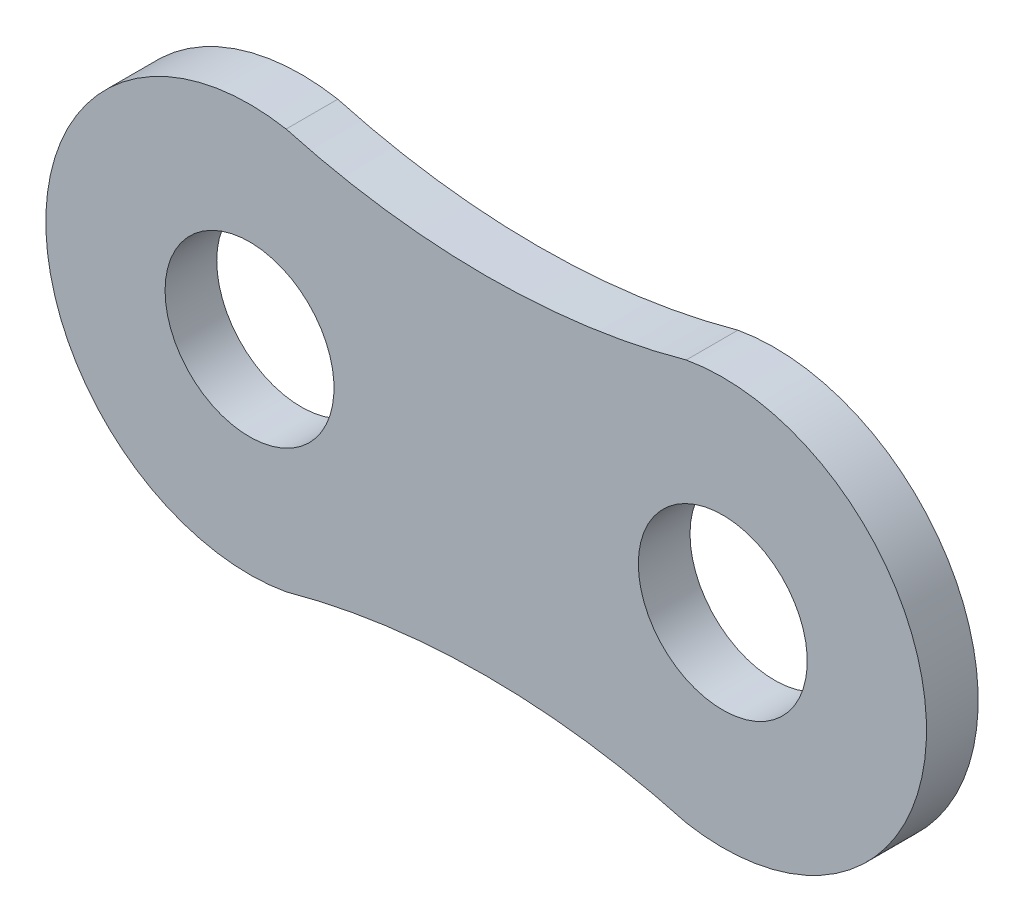
ISO-10303-21;
HEADER;
FILE_DESCRIPTION(('STEP AP214'),'2;1');
FILE_NAME('part.step','',(''),(''),'','','');
FILE_SCHEMA(('AUTOMOTIVE_DESIGN { 1 0 10303 214 1 1 1 1 }'));
ENDSEC;
DATA;
#1=APPLICATION_CONTEXT('core data for automotive mechanical design processes');
#2=APPLICATION_PROTOCOL_DEFINITION('international standard','automotive_design',2000,#1);
#3=PRODUCT_CONTEXT('',#1,'mechanical');
#4=PRODUCT('Part','Part','',(#3));
#5=PRODUCT_RELATED_PRODUCT_CATEGORY('part','',(#4));
#6=PRODUCT_DEFINITION_FORMATION('','',#4);
#7=PRODUCT_DEFINITION_CONTEXT('part definition',#1,'design');
#8=PRODUCT_DEFINITION('design','',#6,#7);
#9=PRODUCT_DEFINITION_SHAPE('','',#8);
#10=(LENGTH_UNIT() NAMED_UNIT(*) SI_UNIT(.MILLI.,.METRE.));
#11=(NAMED_UNIT(*) PLANE_ANGLE_UNIT() SI_UNIT($,.RADIAN.));
#12=(NAMED_UNIT(*) SI_UNIT($,.STERADIAN.) SOLID_ANGLE_UNIT());
#13=UNCERTAINTY_MEASURE_WITH_UNIT(LENGTH_MEASURE(1.E-05),#10,'distance_accuracy_value','');
#14=(GEOMETRIC_REPRESENTATION_CONTEXT(3) GLOBAL_UNCERTAINTY_ASSIGNED_CONTEXT((#13)) GLOBAL_UNIT_ASSIGNED_CONTEXT((#10,
#11,#12)) REPRESENTATION_CONTEXT('',''));
#15=CARTESIAN_POINT('',(0.,0.,0.));
#16=DIRECTION('',(0.,0.,1.));
#17=DIRECTION('',(1.,0.,0.));
#18=AXIS2_PLACEMENT_3D('',#15,#16,#17);
#19=CARTESIAN_POINT('',(36.135896866744,-10.7554672915547,13.84));
#20=DIRECTION('',(0.,0.,-1.));
#21=DIRECTION('',(-1.,0.,0.));
#22=AXIS2_PLACEMENT_3D('',#19,#20,#21);
#23=PLANE('',#22);
#24=CARTESIAN_POINT('',(12.7,0.,13.84));
#25=DIRECTION('',(0.,0.,-1.));
#26=DIRECTION('',(-1.,0.,0.));
#27=AXIS2_PLACEMENT_3D('',#24,#25,#26);
#28=CIRCLE('',#27,4.53333333333333);
#29=CARTESIAN_POINT('',(8.16666666666667,0.,13.84));
#30=VERTEX_POINT('',#29);
#31=EDGE_CURVE('E110',#30,#30,#28,.T.);
#32=ORIENTED_EDGE('',*,*,#31,.T.);
#33=EDGE_LOOP('',(#32));
#34=FACE_BOUND('',#33,.T.);
#35=CARTESIAN_POINT('',(38.1,0.,13.84));
#36=DIRECTION('',(0.,0.,-1.));
#37=DIRECTION('',(-1.,0.,0.));
#38=AXIS2_PLACEMENT_3D('',#35,#36,#37);
#39=CIRCLE('',#38,4.53333333333333);
#40=CARTESIAN_POINT('',(33.5666666666667,0.,13.84));
#41=VERTEX_POINT('',#40);
#42=EDGE_CURVE('E113',#41,#41,#39,.T.);
#43=ORIENTED_EDGE('',*,*,#42,.T.);
#44=EDGE_LOOP('',(#43));
#45=FACE_BOUND('',#44,.T.);
#46=CARTESIAN_POINT('',(25.4,49.4607072271947,13.84));
#47=DIRECTION('',(0.,0.,-1.));
#48=DIRECTION('',(-1.,0.,0.));
#49=AXIS2_PLACEMENT_3D('',#46,#47,#48);
#50=CIRCLE('',#49,40.1665915906267);
#51=CARTESIAN_POINT('',(36.1358968666864,10.7554672915446,13.84));
#52=VERTEX_POINT('',#51);
#53=CARTESIAN_POINT('',(14.6641031333129,10.755467291547,13.84));
#54=VERTEX_POINT('',#53);
#55=EDGE_CURVE('E87',#52,#54,#50,.T.);
#56=ORIENTED_EDGE('',*,*,#55,.T.);
#57=CARTESIAN_POINT('',(12.7,0.,13.84));
#58=DIRECTION('',(0.,0.,-1.));
#59=DIRECTION('',(-1.,0.,0.));
#60=AXIS2_PLACEMENT_3D('',#57,#58,#59);
#61=CIRCLE('',#60,10.9333333333333);
#62=CARTESIAN_POINT('',(14.6641031331999,-10.7554672915653,13.84));
#63=VERTEX_POINT('',#62);
#64=EDGE_CURVE('E86',#63,#54,#61,.T.);
#65=ORIENTED_EDGE('',*,*,#64,.F.);
#66=CARTESIAN_POINT('',(25.4,-49.4607072271733,13.84));
#67=DIRECTION('',(0.,0.,-1.));
#68=DIRECTION('',(-1.,0.,0.));
#69=AXIS2_PLACEMENT_3D('',#66,#67,#68);
#70=CIRCLE('',#69,40.1665915906267);
#71=CARTESIAN_POINT('',(36.1358968668109,-10.7554672915673,13.84));
#72=VERTEX_POINT('',#71);
#73=EDGE_CURVE('E40',#63,#72,#70,.T.);
#74=ORIENTED_EDGE('',*,*,#73,.T.);
#75=CARTESIAN_POINT('',(38.1,0.,13.84));
#76=DIRECTION('',(0.,0.,-1.));
#77=DIRECTION('',(-1.,0.,0.));
#78=AXIS2_PLACEMENT_3D('',#75,#76,#77);
#79=CIRCLE('',#78,10.9333333333333);
#80=EDGE_CURVE('E116',#52,#72,#79,.T.);
#81=ORIENTED_EDGE('',*,*,#80,.F.);
#82=EDGE_LOOP('',(#56,#65,#74,#81));
#83=FACE_BOUND('',#82,.T.);
#84=ADVANCED_FACE('F37',(#34,#45,#83),#23,.F.);
#85=CARTESIAN_POINT('',(25.4,-49.4607072271733,11.0666666666667));
#86=DIRECTION('',(0.,0.,-1.));
#87=DIRECTION('',(-1.,0.,0.));
#88=AXIS2_PLACEMENT_3D('',#85,#86,#87);
#89=CYLINDRICAL_SURFACE('',#88,40.1665915906267);
#90=ORIENTED_EDGE('',*,*,#73,.F.);
#91=DIRECTION('',(0.,0.,-1.));
#92=VECTOR('',#91,1.);
#93=CARTESIAN_POINT('',(14.664103133288,-10.7554672915493,11.0666666666667));
#94=LINE('',#93,#92);
#95=CARTESIAN_POINT('',(14.6641031331997,-10.7554672915654,11.0666666666667));
#96=VERTEX_POINT('',#95);
#97=EDGE_CURVE('E78',#96,#63,#94,.F.);
#98=ORIENTED_EDGE('',*,*,#97,.F.);
#99=CARTESIAN_POINT('',(25.4,-49.4607072271733,11.0666666666667));
#100=DIRECTION('',(0.,0.,-1.));
#101=DIRECTION('',(-1.,0.,0.));
#102=AXIS2_PLACEMENT_3D('',#99,#100,#101);
#103=CIRCLE('',#102,40.1665915906267);
#104=CARTESIAN_POINT('',(36.1358968668109,-10.7554672915673,11.0666666666667));
#105=VERTEX_POINT('',#104);
#106=EDGE_CURVE('E108',#105,#96,#103,.F.);
#107=ORIENTED_EDGE('',*,*,#106,.F.);
#108=DIRECTION('',(0.,0.,-1.));
#109=VECTOR('',#108,1.);
#110=CARTESIAN_POINT('',(36.1358968667336,-10.7554672915532,11.0666666666667));
#111=LINE('',#110,#109);
#112=EDGE_CURVE('E81',#72,#105,#111,.T.);
#113=ORIENTED_EDGE('',*,*,#112,.F.);
#114=EDGE_LOOP('',(#90,#98,#107,#113));
#115=FACE_BOUND('',#114,.T.);
#116=ADVANCED_FACE('F76',(#115),#89,.F.);
#117=CARTESIAN_POINT('',(12.7,0.,11.0666666666667));
#118=DIRECTION('',(0.,0.,-1.));
#119=DIRECTION('',(-1.,0.,0.));
#120=AXIS2_PLACEMENT_3D('',#117,#118,#119);
#121=CYLINDRICAL_SURFACE('',#120,10.9333333333333);
#122=ORIENTED_EDGE('',*,*,#64,.T.);
#123=DIRECTION('',(0.,0.,-1.));
#124=VECTOR('',#123,1.);
#125=CARTESIAN_POINT('',(14.6641031332892,10.7554672915535,11.0666666666667));
#126=LINE('',#125,#124);
#127=CARTESIAN_POINT('',(14.6641031333129,10.755467291547,11.0666666666667));
#128=VERTEX_POINT('',#127);
#129=EDGE_CURVE('E96',#54,#128,#126,.T.);
#130=ORIENTED_EDGE('',*,*,#129,.T.);
#131=CARTESIAN_POINT('',(12.7,0.,11.0666666666667));
#132=DIRECTION('',(0.,0.,-1.));
#133=DIRECTION('',(-1.,0.,0.));
#134=AXIS2_PLACEMENT_3D('',#131,#132,#133);
#135=CIRCLE('',#134,10.9333333333333);
#136=EDGE_CURVE('E92',#96,#128,#135,.T.);
#137=ORIENTED_EDGE('',*,*,#136,.F.);
#138=ORIENTED_EDGE('',*,*,#97,.T.);
#139=EDGE_LOOP('',(#122,#130,#137,#138));
#140=FACE_BOUND('',#139,.T.);
#141=ADVANCED_FACE('F90',(#140),#121,.T.);
#142=CARTESIAN_POINT('',(25.4,49.4607072271947,11.0666666666667));
#143=DIRECTION('',(0.,0.,-1.));
#144=DIRECTION('',(-1.,0.,0.));
#145=AXIS2_PLACEMENT_3D('',#142,#143,#144);
#146=CYLINDRICAL_SURFACE('',#145,40.1665915906267);
#147=ORIENTED_EDGE('',*,*,#55,.F.);
#148=DIRECTION('',(0.,0.,-1.));
#149=VECTOR('',#148,1.);
#150=CARTESIAN_POINT('',(36.1358968667094,10.7554672915488,11.0666666666667));
#151=LINE('',#150,#149);
#152=CARTESIAN_POINT('',(36.1358968666865,10.7554672915446,11.0666666666667));
#153=VERTEX_POINT('',#152);
#154=EDGE_CURVE('E55',#153,#52,#151,.F.);
#155=ORIENTED_EDGE('',*,*,#154,.F.);
#156=CARTESIAN_POINT('',(25.4,49.4607072271947,11.0666666666667));
#157=DIRECTION('',(0.,0.,-1.));
#158=DIRECTION('',(-1.,0.,0.));
#159=AXIS2_PLACEMENT_3D('',#156,#157,#158);
#160=CIRCLE('',#159,40.1665915906267);
#161=EDGE_CURVE('E104',#128,#153,#160,.F.);
#162=ORIENTED_EDGE('',*,*,#161,.F.);
#163=ORIENTED_EDGE('',*,*,#129,.F.);
#164=EDGE_LOOP('',(#147,#155,#162,#163));
#165=FACE_BOUND('',#164,.T.);
#166=ADVANCED_FACE('F123',(#165),#146,.F.);
#167=CARTESIAN_POINT('',(38.1,0.,11.0666666666667));
#168=DIRECTION('',(0.,0.,-1.));
#169=DIRECTION('',(-1.,0.,0.));
#170=AXIS2_PLACEMENT_3D('',#167,#168,#169);
#171=CYLINDRICAL_SURFACE('',#170,10.9333333333333);
#172=ORIENTED_EDGE('',*,*,#80,.T.);
#173=ORIENTED_EDGE('',*,*,#112,.T.);
#174=CARTESIAN_POINT('',(38.1,0.,11.0666666666667));
#175=DIRECTION('',(0.,0.,-1.));
#176=DIRECTION('',(-1.,0.,0.));
#177=AXIS2_PLACEMENT_3D('',#174,#175,#176);
#178=CIRCLE('',#177,10.9333333333333);
#179=EDGE_CURVE('E101',#153,#105,#178,.T.);
#180=ORIENTED_EDGE('',*,*,#179,.F.);
#181=ORIENTED_EDGE('',*,*,#154,.T.);
#182=EDGE_LOOP('',(#172,#173,#180,#181));
#183=FACE_BOUND('',#182,.T.);
#184=ADVANCED_FACE('F120',(#183),#171,.T.);
#185=CARTESIAN_POINT('',(38.1,0.,11.0666666666667));
#186=DIRECTION('',(0.,0.,-1.));
#187=DIRECTION('',(-1.,0.,0.));
#188=AXIS2_PLACEMENT_3D('',#185,#186,#187);
#189=CYLINDRICAL_SURFACE('',#188,4.53333333333333);
#190=ORIENTED_EDGE('',*,*,#42,.F.);
#191=EDGE_LOOP('',(#190));
#192=FACE_BOUND('',#191,.T.);
#193=CARTESIAN_POINT('',(38.1,0.,11.0666666666667));
#194=DIRECTION('',(0.,0.,-1.));
#195=DIRECTION('',(-1.,0.,0.));
#196=AXIS2_PLACEMENT_3D('',#193,#194,#195);
#197=CIRCLE('',#196,4.53333333333333);
#198=CARTESIAN_POINT('',(33.5666666666667,0.,11.0666666666667));
#199=VERTEX_POINT('',#198);
#200=EDGE_CURVE('E46',#199,#199,#197,.F.);
#201=ORIENTED_EDGE('',*,*,#200,.F.);
#202=EDGE_LOOP('',(#201));
#203=FACE_BOUND('',#202,.T.);
#204=ADVANCED_FACE('F130',(#192,#203),#189,.F.);
#205=CARTESIAN_POINT('',(12.7,0.,11.0666666666667));
#206=DIRECTION('',(0.,0.,-1.));
#207=DIRECTION('',(-1.,0.,0.));
#208=AXIS2_PLACEMENT_3D('',#205,#206,#207);
#209=CYLINDRICAL_SURFACE('',#208,4.53333333333333);
#210=ORIENTED_EDGE('',*,*,#31,.F.);
#211=EDGE_LOOP('',(#210));
#212=FACE_BOUND('',#211,.T.);
#213=CARTESIAN_POINT('',(12.7,0.,11.0666666666667));
#214=DIRECTION('',(0.,0.,-1.));
#215=DIRECTION('',(-1.,0.,0.));
#216=AXIS2_PLACEMENT_3D('',#213,#214,#215);
#217=CIRCLE('',#216,4.53333333333333);
#218=CARTESIAN_POINT('',(8.16666666666667,0.,11.0666666666667));
#219=VERTEX_POINT('',#218);
#220=EDGE_CURVE('E11',#219,#219,#217,.F.);
#221=ORIENTED_EDGE('',*,*,#220,.F.);
#222=EDGE_LOOP('',(#221));
#223=FACE_BOUND('',#222,.T.);
#224=ADVANCED_FACE('F134',(#212,#223),#209,.F.);
#225=CARTESIAN_POINT('',(36.135896866744,-10.7554672915547,11.0666666666667));
#226=DIRECTION('',(0.,0.,-1.));
#227=DIRECTION('',(-1.,0.,0.));
#228=AXIS2_PLACEMENT_3D('',#225,#226,#227);
#229=PLANE('',#228);
#230=ORIENTED_EDGE('',*,*,#220,.T.);
#231=EDGE_LOOP('',(#230));
#232=FACE_BOUND('',#231,.T.);
#233=ORIENTED_EDGE('',*,*,#200,.T.);
#234=EDGE_LOOP('',(#233));
#235=FACE_BOUND('',#234,.T.);
#236=ORIENTED_EDGE('',*,*,#161,.T.);
#237=ORIENTED_EDGE('',*,*,#179,.T.);
#238=ORIENTED_EDGE('',*,*,#106,.T.);
#239=ORIENTED_EDGE('',*,*,#136,.T.);
#240=EDGE_LOOP('',(#236,#237,#238,#239));
#241=FACE_BOUND('',#240,.T.);
#242=ADVANCED_FACE('F122',(#232,#235,#241),#229,.T.);
#243=CLOSED_SHELL('',(#84,#116,#141,#166,#184,#204,#224,#242));
#244=MANIFOLD_SOLID_BREP('B2',#243);
#245=ADVANCED_BREP_SHAPE_REPRESENTATION('',(#18,#244),#14);
#246=SHAPE_DEFINITION_REPRESENTATION(#9,#245);
ENDSEC;
END-ISO-10303-21;
